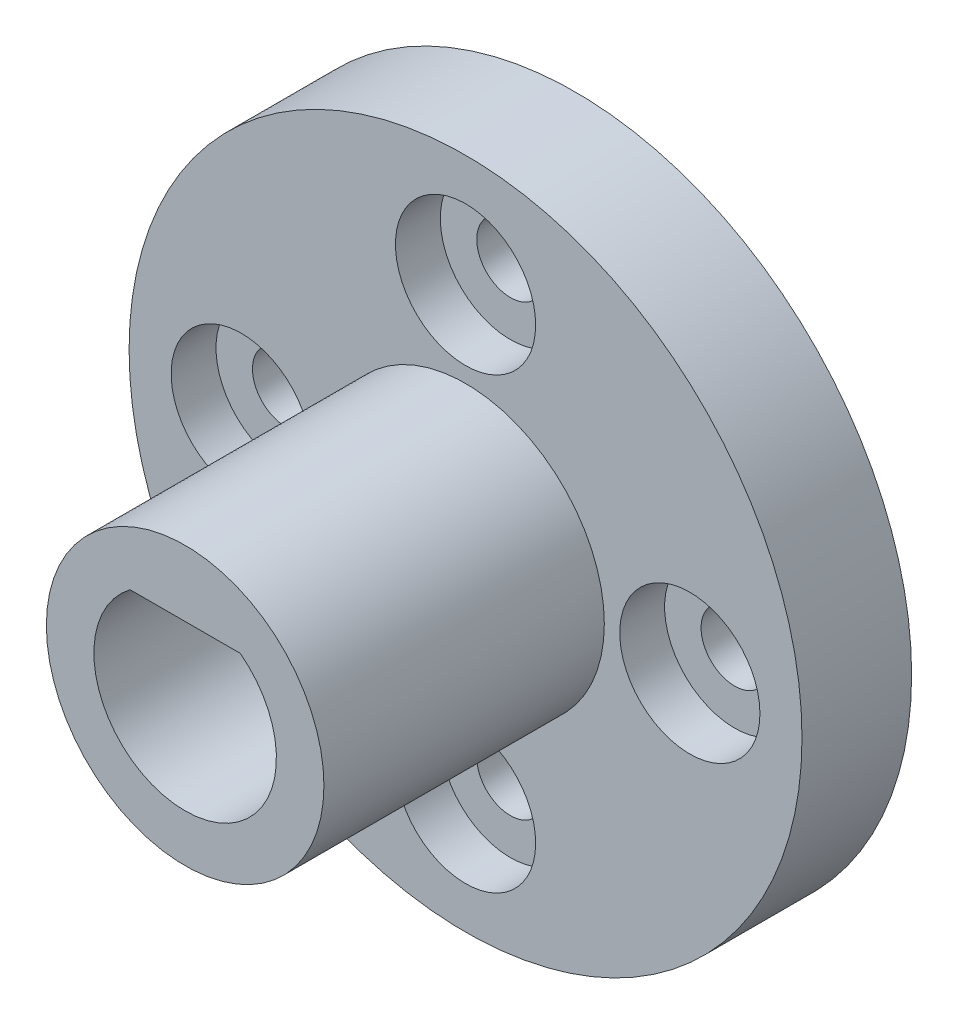
ISO-10303-21;
HEADER;
FILE_DESCRIPTION(('STEP AP214'),'2;1');
FILE_NAME('part.step','',(''),(''),'','','');
FILE_SCHEMA(('AUTOMOTIVE_DESIGN { 1 0 10303 214 1 1 1 1 }'));
ENDSEC;
DATA;
#1=APPLICATION_CONTEXT('core data for automotive mechanical design processes');
#2=APPLICATION_PROTOCOL_DEFINITION('international standard','automotive_design',2000,#1);
#3=PRODUCT_CONTEXT('',#1,'mechanical');
#4=PRODUCT('Part','Part','',(#3));
#5=PRODUCT_RELATED_PRODUCT_CATEGORY('part','',(#4));
#6=PRODUCT_DEFINITION_FORMATION('','',#4);
#7=PRODUCT_DEFINITION_CONTEXT('part definition',#1,'design');
#8=PRODUCT_DEFINITION('design','',#6,#7);
#9=PRODUCT_DEFINITION_SHAPE('','',#8);
#10=(LENGTH_UNIT() NAMED_UNIT(*) SI_UNIT(.MILLI.,.METRE.));
#11=(NAMED_UNIT(*) PLANE_ANGLE_UNIT() SI_UNIT($,.RADIAN.));
#12=(NAMED_UNIT(*) SI_UNIT($,.STERADIAN.) SOLID_ANGLE_UNIT());
#13=UNCERTAINTY_MEASURE_WITH_UNIT(LENGTH_MEASURE(1.E-05),#10,'distance_accuracy_value','');
#14=(GEOMETRIC_REPRESENTATION_CONTEXT(3) GLOBAL_UNCERTAINTY_ASSIGNED_CONTEXT((#13)) GLOBAL_UNIT_ASSIGNED_CONTEXT((#10,
#11,#12)) REPRESENTATION_CONTEXT('',''));
#15=CARTESIAN_POINT('',(0.,0.,0.));
#16=DIRECTION('',(0.,0.,1.));
#17=DIRECTION('',(1.,0.,0.));
#18=AXIS2_PLACEMENT_3D('',#15,#16,#17);
#19=CARTESIAN_POINT('',(0.,0.,3.91));
#20=DIRECTION('',(0.,0.,-1.));
#21=DIRECTION('',(-1.,0.,0.));
#22=AXIS2_PLACEMENT_3D('',#19,#20,#21);
#23=CYLINDRICAL_SURFACE('',#22,12.);
#24=CARTESIAN_POINT('',(0.,0.,3.91));
#25=DIRECTION('',(0.,0.,1.));
#26=DIRECTION('',(1.,0.,0.));
#27=AXIS2_PLACEMENT_3D('',#24,#25,#26);
#28=CIRCLE('',#27,12.);
#29=CARTESIAN_POINT('',(12.,0.,3.91));
#30=VERTEX_POINT('',#29);
#31=EDGE_CURVE('E11',#30,#30,#28,.T.);
#32=ORIENTED_EDGE('',*,*,#31,.F.);
#33=EDGE_LOOP('',(#32));
#34=FACE_BOUND('',#33,.T.);
#35=CARTESIAN_POINT('',(0.,0.,0.));
#36=DIRECTION('',(0.,0.,1.));
#37=DIRECTION('',(1.,0.,0.));
#38=AXIS2_PLACEMENT_3D('',#35,#36,#37);
#39=CIRCLE('',#38,12.);
#40=CARTESIAN_POINT('',(12.,0.,0.));
#41=VERTEX_POINT('',#40);
#42=EDGE_CURVE('E40',#41,#41,#39,.T.);
#43=ORIENTED_EDGE('',*,*,#42,.T.);
#44=EDGE_LOOP('',(#43));
#45=FACE_BOUND('',#44,.T.);
#46=ADVANCED_FACE('F37',(#34,#45),#23,.T.);
#47=CARTESIAN_POINT('',(0.,0.,3.91));
#48=DIRECTION('',(0.,0.,1.));
#49=DIRECTION('',(1.,0.,0.));
#50=AXIS2_PLACEMENT_3D('',#47,#48,#49);
#51=PLANE('',#50);
#52=CARTESIAN_POINT('',(8.,0.,3.91));
#53=DIRECTION('',(0.,0.,1.));
#54=DIRECTION('',(1.,0.,0.));
#55=AXIS2_PLACEMENT_3D('',#52,#53,#54);
#56=CIRCLE('',#55,2.5);
#57=CARTESIAN_POINT('',(10.5,0.,3.91));
#58=VERTEX_POINT('',#57);
#59=EDGE_CURVE('E307',#58,#58,#56,.T.);
#60=ORIENTED_EDGE('',*,*,#59,.F.);
#61=EDGE_LOOP('',(#60));
#62=FACE_BOUND('',#61,.T.);
#63=CARTESIAN_POINT('',(0.,-8.,3.91));
#64=DIRECTION('',(0.,0.,1.));
#65=DIRECTION('',(1.,0.,0.));
#66=AXIS2_PLACEMENT_3D('',#63,#64,#65);
#67=CIRCLE('',#66,2.5);
#68=CARTESIAN_POINT('',(2.5,-8.,3.91));
#69=VERTEX_POINT('',#68);
#70=EDGE_CURVE('E317',#69,#69,#67,.T.);
#71=ORIENTED_EDGE('',*,*,#70,.F.);
#72=EDGE_LOOP('',(#71));
#73=FACE_BOUND('',#72,.T.);
#74=CARTESIAN_POINT('',(-8.,0.,3.91));
#75=DIRECTION('',(0.,0.,1.));
#76=DIRECTION('',(1.,0.,0.));
#77=AXIS2_PLACEMENT_3D('',#74,#75,#76);
#78=CIRCLE('',#77,2.5);
#79=CARTESIAN_POINT('',(-5.50000000000001,0.,3.91));
#80=VERTEX_POINT('',#79);
#81=EDGE_CURVE('E329',#80,#80,#78,.T.);
#82=ORIENTED_EDGE('',*,*,#81,.F.);
#83=EDGE_LOOP('',(#82));
#84=FACE_BOUND('',#83,.T.);
#85=CARTESIAN_POINT('',(0.,8.,3.91));
#86=DIRECTION('',(0.,0.,1.));
#87=DIRECTION('',(1.,0.,0.));
#88=AXIS2_PLACEMENT_3D('',#85,#86,#87);
#89=CIRCLE('',#88,2.5);
#90=CARTESIAN_POINT('',(2.5,8.,3.91));
#91=VERTEX_POINT('',#90);
#92=EDGE_CURVE('E341',#91,#91,#89,.T.);
#93=ORIENTED_EDGE('',*,*,#92,.F.);
#94=EDGE_LOOP('',(#93));
#95=FACE_BOUND('',#94,.T.);
#96=CARTESIAN_POINT('',(0.,0.,3.91));
#97=DIRECTION('',(0.,0.,1.));
#98=DIRECTION('',(1.,0.,0.));
#99=AXIS2_PLACEMENT_3D('',#96,#97,#98);
#100=CIRCLE('',#99,4.95);
#101=CARTESIAN_POINT('',(4.95,0.,3.91));
#102=VERTEX_POINT('',#101);
#103=EDGE_CURVE('E77',#102,#102,#100,.T.);
#104=ORIENTED_EDGE('',*,*,#103,.F.);
#105=EDGE_LOOP('',(#104));
#106=FACE_BOUND('',#105,.T.);
#107=ORIENTED_EDGE('',*,*,#31,.T.);
#108=EDGE_LOOP('',(#107));
#109=FACE_BOUND('',#108,.T.);
#110=ADVANCED_FACE('F96',(#62,#73,#84,#95,#106,#109),#51,.T.);
#111=CARTESIAN_POINT('',(0.,0.,0.));
#112=DIRECTION('',(0.,0.,1.));
#113=DIRECTION('',(1.,0.,0.));
#114=AXIS2_PLACEMENT_3D('',#111,#112,#113);
#115=PLANE('',#114);
#116=CARTESIAN_POINT('',(8.,0.,0.));
#117=DIRECTION('',(0.,0.,1.));
#118=DIRECTION('',(1.,0.,0.));
#119=AXIS2_PLACEMENT_3D('',#116,#117,#118);
#120=CIRCLE('',#119,1.2);
#121=CARTESIAN_POINT('',(9.2,0.,0.));
#122=VERTEX_POINT('',#121);
#123=EDGE_CURVE('E314',#122,#122,#120,.T.);
#124=ORIENTED_EDGE('',*,*,#123,.T.);
#125=EDGE_LOOP('',(#124));
#126=FACE_BOUND('',#125,.T.);
#127=CARTESIAN_POINT('',(0.,-8.,0.));
#128=DIRECTION('',(0.,0.,1.));
#129=DIRECTION('',(1.,0.,0.));
#130=AXIS2_PLACEMENT_3D('',#127,#128,#129);
#131=CIRCLE('',#130,1.2);
#132=CARTESIAN_POINT('',(1.2,-8.,0.));
#133=VERTEX_POINT('',#132);
#134=EDGE_CURVE('E326',#133,#133,#131,.T.);
#135=ORIENTED_EDGE('',*,*,#134,.T.);
#136=EDGE_LOOP('',(#135));
#137=FACE_BOUND('',#136,.T.);
#138=CARTESIAN_POINT('',(-8.,0.,0.));
#139=DIRECTION('',(0.,0.,1.));
#140=DIRECTION('',(1.,0.,0.));
#141=AXIS2_PLACEMENT_3D('',#138,#139,#140);
#142=CIRCLE('',#141,1.2);
#143=CARTESIAN_POINT('',(-6.8,0.,0.));
#144=VERTEX_POINT('',#143);
#145=EDGE_CURVE('E338',#144,#144,#142,.T.);
#146=ORIENTED_EDGE('',*,*,#145,.T.);
#147=EDGE_LOOP('',(#146));
#148=FACE_BOUND('',#147,.T.);
#149=CARTESIAN_POINT('',(0.,8.,0.));
#150=DIRECTION('',(0.,0.,1.));
#151=DIRECTION('',(1.,0.,0.));
#152=AXIS2_PLACEMENT_3D('',#149,#150,#151);
#153=CIRCLE('',#152,1.2);
#154=CARTESIAN_POINT('',(1.2,8.,0.));
#155=VERTEX_POINT('',#154);
#156=EDGE_CURVE('E67',#155,#155,#153,.T.);
#157=ORIENTED_EDGE('',*,*,#156,.T.);
#158=EDGE_LOOP('',(#157));
#159=FACE_BOUND('',#158,.T.);
#160=CARTESIAN_POINT('',(0.,0.,0.));
#161=DIRECTION('',(0.,0.,-1.));
#162=DIRECTION('',(-1.,0.,0.));
#163=AXIS2_PLACEMENT_3D('',#160,#161,#162);
#164=CIRCLE('',#163,4.);
#165=CARTESIAN_POINT('',(-4.,0.,0.));
#166=VERTEX_POINT('',#165);
#167=EDGE_CURVE('E84',#166,#166,#164,.T.);
#168=ORIENTED_EDGE('',*,*,#167,.F.);
#169=EDGE_LOOP('',(#168));
#170=FACE_BOUND('',#169,.T.);
#171=ORIENTED_EDGE('',*,*,#42,.F.);
#172=EDGE_LOOP('',(#171));
#173=FACE_BOUND('',#172,.T.);
#174=ADVANCED_FACE('F93',(#126,#137,#148,#159,#170,#173),#115,.F.);
#175=CARTESIAN_POINT('',(0.,0.,1.91));
#176=DIRECTION('',(0.,0.,-1.));
#177=DIRECTION('',(-1.,0.,0.));
#178=AXIS2_PLACEMENT_3D('',#175,#176,#177);
#179=CYLINDRICAL_SURFACE('',#178,4.);
#180=CARTESIAN_POINT('',(0.,0.,1.91));
#181=DIRECTION('',(0.,0.,-1.));
#182=DIRECTION('',(-1.,0.,0.));
#183=AXIS2_PLACEMENT_3D('',#180,#181,#182);
#184=CIRCLE('',#183,4.);
#185=CARTESIAN_POINT('',(-4.,0.,1.91));
#186=VERTEX_POINT('',#185);
#187=EDGE_CURVE('E85',#186,#186,#184,.T.);
#188=CARTESIAN_POINT('',(-4.,0.,1.91));
#189=CARTESIAN_POINT('',(-4.,0.,1.89010416666667));
#190=CARTESIAN_POINT('',(-4.,0.,1.87020833333333));
#191=CARTESIAN_POINT('',(-4.,0.,1.83041666666667));
#192=CARTESIAN_POINT('',(-4.,0.,1.81052083333333));
#193=CARTESIAN_POINT('',(-4.,0.,1.77072916666667));
#194=CARTESIAN_POINT('',(-4.,0.,1.75083333333333));
#195=CARTESIAN_POINT('',(-4.,0.,1.71104166666667));
#196=CARTESIAN_POINT('',(-4.,0.,1.69114583333333));
#197=CARTESIAN_POINT('',(-4.,0.,1.65135416666667));
#198=CARTESIAN_POINT('',(-4.,0.,1.63145833333333));
#199=CARTESIAN_POINT('',(-4.,0.,1.59166666666667));
#200=CARTESIAN_POINT('',(-4.,0.,1.57177083333333));
#201=CARTESIAN_POINT('',(-4.,0.,1.53197916666667));
#202=CARTESIAN_POINT('',(-4.,0.,1.51208333333333));
#203=CARTESIAN_POINT('',(-4.,0.,1.47229166666667));
#204=CARTESIAN_POINT('',(-4.,0.,1.45239583333333));
#205=CARTESIAN_POINT('',(-4.,0.,1.41260416666667));
#206=CARTESIAN_POINT('',(-4.,0.,1.39270833333333));
#207=CARTESIAN_POINT('',(-4.,0.,1.35291666666667));
#208=CARTESIAN_POINT('',(-4.,0.,1.33302083333333));
#209=CARTESIAN_POINT('',(-4.,0.,1.29322916666667));
#210=CARTESIAN_POINT('',(-4.,0.,1.27333333333333));
#211=CARTESIAN_POINT('',(-4.,0.,1.23354166666667));
#212=CARTESIAN_POINT('',(-4.,0.,1.21364583333333));
#213=CARTESIAN_POINT('',(-4.,0.,1.17385416666667));
#214=CARTESIAN_POINT('',(-4.,0.,1.15395833333333));
#215=CARTESIAN_POINT('',(-4.,0.,1.11416666666667));
#216=CARTESIAN_POINT('',(-4.,0.,1.09427083333333));
#217=CARTESIAN_POINT('',(-4.,0.,1.05447916666667));
#218=CARTESIAN_POINT('',(-4.,0.,1.03458333333333));
#219=CARTESIAN_POINT('',(-4.,0.,0.994791666666667));
#220=CARTESIAN_POINT('',(-4.,0.,0.974895833333334));
#221=CARTESIAN_POINT('',(-4.,0.,0.935104166666667));
#222=CARTESIAN_POINT('',(-4.,0.,0.915208333333333));
#223=CARTESIAN_POINT('',(-4.,0.,0.875416666666667));
#224=CARTESIAN_POINT('',(-4.,0.,0.855520833333333));
#225=CARTESIAN_POINT('',(-4.,0.,0.815729166666667));
#226=CARTESIAN_POINT('',(-4.,0.,0.795833333333333));
#227=CARTESIAN_POINT('',(-4.,0.,0.756041666666667));
#228=CARTESIAN_POINT('',(-4.,0.,0.736145833333333));
#229=CARTESIAN_POINT('',(-4.,0.,0.696354166666667));
#230=CARTESIAN_POINT('',(-4.,0.,0.676458333333333));
#231=CARTESIAN_POINT('',(-4.,0.,0.636666666666667));
#232=CARTESIAN_POINT('',(-4.,0.,0.616770833333333));
#233=CARTESIAN_POINT('',(-4.,0.,0.576979166666667));
#234=CARTESIAN_POINT('',(-4.,0.,0.557083333333333));
#235=CARTESIAN_POINT('',(-4.,0.,0.517291666666667));
#236=CARTESIAN_POINT('',(-4.,0.,0.497395833333333));
#237=CARTESIAN_POINT('',(-4.,0.,0.457604166666667));
#238=CARTESIAN_POINT('',(-4.,0.,0.437708333333333));
#239=CARTESIAN_POINT('',(-4.,0.,0.397916666666667));
#240=CARTESIAN_POINT('',(-4.,0.,0.378020833333333));
#241=CARTESIAN_POINT('',(-4.,0.,0.338229166666667));
#242=CARTESIAN_POINT('',(-4.,0.,0.318333333333333));
#243=CARTESIAN_POINT('',(-4.,0.,0.278541666666667));
#244=CARTESIAN_POINT('',(-4.,0.,0.258645833333333));
#245=CARTESIAN_POINT('',(-4.,0.,0.218854166666667));
#246=CARTESIAN_POINT('',(-4.,0.,0.198958333333333));
#247=CARTESIAN_POINT('',(-4.,0.,0.159166666666667));
#248=CARTESIAN_POINT('',(-4.,0.,0.139270833333333));
#249=CARTESIAN_POINT('',(-4.,0.,0.0994791666666668));
#250=CARTESIAN_POINT('',(-4.,0.,0.0795833333333334));
#251=CARTESIAN_POINT('',(-4.,0.,0.0397916666666667));
#252=CARTESIAN_POINT('',(-4.,0.,0.0198958333333334));
#253=CARTESIAN_POINT('',(-4.,0.,0.));
#254=B_SPLINE_CURVE_WITH_KNOTS('',3,(#188,#189,#190,#191,#192,#193,#194,#195,#196,#197,#198,
#199,#200,#201,#202,#203,#204,#205,#206,#207,#208,#209,#210,#211,#212,#213,#214,#215,#216,#217,
#218,#219,#220,#221,#222,#223,#224,#225,#226,#227,#228,#229,#230,#231,#232,#233,#234,#235,#236,
#237,#238,#239,#240,#241,#242,#243,#244,#245,#246,#247,#248,#249,#250,#251,#252,#253),
.UNSPECIFIED.,.F.,.F.,(4,2,2,2,2,2,2,2,2,2,2,2,2,2,2,2,2,2,2,2,2,2,2,2,2,2,2,2,2,2,2,2,4),(0.,
0.0596874999999998,0.119375,0.1790625,0.23875,0.2984375,0.358125,0.4178125,0.4775,0.5371875,
0.596875,0.6565625,0.71625,0.7759375,0.835625,0.8953125,0.955,1.0146875,1.074375,1.1340625,
1.19375,1.2534375,1.313125,1.3728125,1.4325,1.4921875,1.551875,1.6115625,1.67125,1.7309375,
1.790625,1.8503125,1.91),.UNSPECIFIED.);
#255=EDGE_CURVE('BSEAM91',#186,#166,#254,.T.);
#256=ORIENTED_EDGE('',*,*,#187,.F.);
#257=ORIENTED_EDGE('',*,*,#167,.T.);
#258=ORIENTED_EDGE('',*,*,#255,.T.);
#259=ORIENTED_EDGE('',*,*,#255,.F.);
#260=EDGE_LOOP('',(#256,#258,#257,#259));
#261=FACE_BOUND('',#260,.T.);
#262=ADVANCED_FACE('F91',(#261),#179,.F.);
#263=CARTESIAN_POINT('',(0.,0.,1.91));
#264=DIRECTION('',(0.,0.,-1.));
#265=DIRECTION('',(-1.,0.,0.));
#266=AXIS2_PLACEMENT_3D('',#263,#264,#265);
#267=PLANE('',#266);
#268=ORIENTED_EDGE('',*,*,#187,.T.);
#269=EDGE_LOOP('',(#268));
#270=FACE_BOUND('',#269,.T.);
#271=ADVANCED_FACE('F140',(#270),#267,.T.);
#272=CARTESIAN_POINT('',(0.,2.595,13.91));
#273=DIRECTION('',(0.,-1.,0.));
#274=DIRECTION('',(0.,0.,-1.));
#275=AXIS2_PLACEMENT_3D('',#272,#273,#274);
#276=PLANE('',#275);
#277=DIRECTION('',(-1.,0.,0.));
#278=VECTOR('',#277,1.);
#279=CARTESIAN_POINT('',(0.,2.595,3.91));
#280=LINE('',#279,#278);
#281=CARTESIAN_POINT('',(1.96494274725754,2.595,3.91));
#282=VERTEX_POINT('',#281);
#283=CARTESIAN_POINT('',(-1.96494274725754,2.595,3.91));
#284=VERTEX_POINT('',#283);
#285=EDGE_CURVE('E64',#282,#284,#280,.T.);
#286=ORIENTED_EDGE('',*,*,#285,.F.);
#287=DIRECTION('',(0.,0.,-1.));
#288=VECTOR('',#287,1.);
#289=CARTESIAN_POINT('',(1.96494274725754,2.595,13.91));
#290=LINE('',#289,#288);
#291=CARTESIAN_POINT('',(1.96494274725754,2.595,13.91));
#292=VERTEX_POINT('',#291);
#293=EDGE_CURVE('E73',#292,#282,#290,.T.);
#294=ORIENTED_EDGE('',*,*,#293,.F.);
#295=DIRECTION('',(-1.,0.,0.));
#296=VECTOR('',#295,1.);
#297=CARTESIAN_POINT('',(0.,2.595,13.91));
#298=LINE('',#297,#296);
#299=CARTESIAN_POINT('',(-1.96494274725754,2.595,13.91));
#300=VERTEX_POINT('',#299);
#301=EDGE_CURVE('E71',#292,#300,#298,.T.);
#302=ORIENTED_EDGE('',*,*,#301,.T.);
#303=DIRECTION('',(0.,0.,-1.));
#304=VECTOR('',#303,1.);
#305=CARTESIAN_POINT('',(-1.96494274725754,2.595,13.91));
#306=LINE('',#305,#304);
#307=EDGE_CURVE('E58',#300,#284,#306,.T.);
#308=ORIENTED_EDGE('',*,*,#307,.T.);
#309=EDGE_LOOP('',(#286,#294,#302,#308));
#310=FACE_BOUND('',#309,.T.);
#311=ADVANCED_FACE('F69',(#310),#276,.T.);
#312=CARTESIAN_POINT('',(0.,0.,13.91));
#313=DIRECTION('',(0.,0.,-1.));
#314=DIRECTION('',(-1.,0.,0.));
#315=AXIS2_PLACEMENT_3D('',#312,#313,#314);
#316=CYLINDRICAL_SURFACE('',#315,3.255);
#317=CARTESIAN_POINT('',(0.,0.,3.91));
#318=DIRECTION('',(0.,0.,1.));
#319=DIRECTION('',(1.,0.,0.));
#320=AXIS2_PLACEMENT_3D('',#317,#318,#319);
#321=CIRCLE('',#320,3.255);
#322=EDGE_CURVE('E50',#284,#282,#321,.T.);
#323=ORIENTED_EDGE('',*,*,#322,.F.);
#324=ORIENTED_EDGE('',*,*,#307,.F.);
#325=CARTESIAN_POINT('',(0.,0.,13.91));
#326=DIRECTION('',(0.,0.,1.));
#327=DIRECTION('',(1.,0.,0.));
#328=AXIS2_PLACEMENT_3D('',#325,#326,#327);
#329=CIRCLE('',#328,3.255);
#330=EDGE_CURVE('E353',#300,#292,#329,.T.);
#331=ORIENTED_EDGE('',*,*,#330,.T.);
#332=ORIENTED_EDGE('',*,*,#293,.T.);
#333=EDGE_LOOP('',(#323,#324,#331,#332));
#334=FACE_BOUND('',#333,.T.);
#335=ADVANCED_FACE('F76',(#334),#316,.F.);
#336=CARTESIAN_POINT('',(0.,0.,13.91));
#337=DIRECTION('',(0.,0.,-1.));
#338=DIRECTION('',(-1.,0.,0.));
#339=AXIS2_PLACEMENT_3D('',#336,#337,#338);
#340=CYLINDRICAL_SURFACE('',#339,4.95);
#341=CARTESIAN_POINT('',(0.,0.,13.91));
#342=DIRECTION('',(0.,0.,1.));
#343=DIRECTION('',(1.,0.,0.));
#344=AXIS2_PLACEMENT_3D('',#341,#342,#343);
#345=CIRCLE('',#344,4.95);
#346=CARTESIAN_POINT('',(4.95,0.,13.91));
#347=VERTEX_POINT('',#346);
#348=EDGE_CURVE('E74',#347,#347,#345,.T.);
#349=ORIENTED_EDGE('',*,*,#348,.F.);
#350=EDGE_LOOP('',(#349));
#351=FACE_BOUND('',#350,.T.);
#352=ORIENTED_EDGE('',*,*,#103,.T.);
#353=EDGE_LOOP('',(#352));
#354=FACE_BOUND('',#353,.T.);
#355=ADVANCED_FACE('F125',(#351,#354),#340,.T.);
#356=CARTESIAN_POINT('',(0.,0.,13.91));
#357=DIRECTION('',(0.,0.,1.));
#358=DIRECTION('',(1.,0.,0.));
#359=AXIS2_PLACEMENT_3D('',#356,#357,#358);
#360=PLANE('',#359);
#361=ORIENTED_EDGE('',*,*,#301,.F.);
#362=ORIENTED_EDGE('',*,*,#330,.F.);
#363=EDGE_LOOP('',(#361,#362));
#364=FACE_BOUND('',#363,.T.);
#365=ORIENTED_EDGE('',*,*,#348,.T.);
#366=EDGE_LOOP('',(#365));
#367=FACE_BOUND('',#366,.T.);
#368=ADVANCED_FACE('F117',(#364,#367),#360,.T.);
#369=ORIENTED_EDGE('',*,*,#285,.T.);
#370=ORIENTED_EDGE('',*,*,#322,.T.);
#371=EDGE_LOOP('',(#369,#370));
#372=FACE_BOUND('',#371,.T.);
#373=ADVANCED_FACE('F65',(#372),#51,.T.);
#374=CARTESIAN_POINT('',(0.,8.,3.91));
#375=DIRECTION('',(0.,0.,1.));
#376=DIRECTION('',(1.,0.,0.));
#377=AXIS2_PLACEMENT_3D('',#374,#375,#376);
#378=CYLINDRICAL_SURFACE('',#377,1.2);
#379=ORIENTED_EDGE('',*,*,#156,.F.);
#380=EDGE_LOOP('',(#379));
#381=FACE_BOUND('',#380,.T.);
#382=CARTESIAN_POINT('',(0.,8.,2.31));
#383=DIRECTION('',(0.,0.,1.));
#384=DIRECTION('',(1.,0.,0.));
#385=AXIS2_PLACEMENT_3D('',#382,#383,#384);
#386=CIRCLE('',#385,1.2);
#387=CARTESIAN_POINT('',(1.2,8.,2.31));
#388=VERTEX_POINT('',#387);
#389=EDGE_CURVE('E347',#388,#388,#386,.T.);
#390=ORIENTED_EDGE('',*,*,#389,.T.);
#391=EDGE_LOOP('',(#390));
#392=FACE_BOUND('',#391,.T.);
#393=ADVANCED_FACE('F116',(#381,#392),#378,.F.);
#394=CARTESIAN_POINT('',(1.2,8.,2.31));
#395=DIRECTION('',(0.,0.,-1.));
#396=DIRECTION('',(-1.,0.,0.));
#397=AXIS2_PLACEMENT_3D('',#394,#395,#396);
#398=PLANE('',#397);
#399=ORIENTED_EDGE('',*,*,#389,.F.);
#400=EDGE_LOOP('',(#399));
#401=FACE_BOUND('',#400,.T.);
#402=CARTESIAN_POINT('',(0.,8.,2.31));
#403=DIRECTION('',(0.,0.,1.));
#404=DIRECTION('',(1.,0.,0.));
#405=AXIS2_PLACEMENT_3D('',#402,#403,#404);
#406=CIRCLE('',#405,2.5);
#407=CARTESIAN_POINT('',(2.5,8.,2.31));
#408=VERTEX_POINT('',#407);
#409=EDGE_CURVE('E344',#408,#408,#406,.T.);
#410=ORIENTED_EDGE('',*,*,#409,.T.);
#411=EDGE_LOOP('',(#410));
#412=FACE_BOUND('',#411,.T.);
#413=ADVANCED_FACE('F122',(#401,#412),#398,.F.);
#414=CARTESIAN_POINT('',(0.,8.,3.91));
#415=DIRECTION('',(0.,0.,1.));
#416=DIRECTION('',(1.,0.,0.));
#417=AXIS2_PLACEMENT_3D('',#414,#415,#416);
#418=CYLINDRICAL_SURFACE('',#417,2.5);
#419=ORIENTED_EDGE('',*,*,#409,.F.);
#420=EDGE_LOOP('',(#419));
#421=FACE_BOUND('',#420,.T.);
#422=ORIENTED_EDGE('',*,*,#92,.T.);
#423=EDGE_LOOP('',(#422));
#424=FACE_BOUND('',#423,.T.);
#425=ADVANCED_FACE('F190',(#421,#424),#418,.F.);
#426=CARTESIAN_POINT('',(-8.,0.,3.91));
#427=DIRECTION('',(0.,0.,1.));
#428=DIRECTION('',(1.,0.,0.));
#429=AXIS2_PLACEMENT_3D('',#426,#427,#428);
#430=CYLINDRICAL_SURFACE('',#429,1.2);
#431=ORIENTED_EDGE('',*,*,#145,.F.);
#432=EDGE_LOOP('',(#431));
#433=FACE_BOUND('',#432,.T.);
#434=CARTESIAN_POINT('',(-8.,0.,2.31));
#435=DIRECTION('',(0.,0.,1.));
#436=DIRECTION('',(1.,0.,0.));
#437=AXIS2_PLACEMENT_3D('',#434,#435,#436);
#438=CIRCLE('',#437,1.2);
#439=CARTESIAN_POINT('',(-6.8,0.,2.31));
#440=VERTEX_POINT('',#439);
#441=EDGE_CURVE('E335',#440,#440,#438,.T.);
#442=ORIENTED_EDGE('',*,*,#441,.T.);
#443=EDGE_LOOP('',(#442));
#444=FACE_BOUND('',#443,.T.);
#445=ADVANCED_FACE('F198',(#433,#444),#430,.F.);
#446=CARTESIAN_POINT('',(-6.8,0.,2.31));
#447=DIRECTION('',(0.,0.,-1.));
#448=DIRECTION('',(-1.,0.,0.));
#449=AXIS2_PLACEMENT_3D('',#446,#447,#448);
#450=PLANE('',#449);
#451=ORIENTED_EDGE('',*,*,#441,.F.);
#452=EDGE_LOOP('',(#451));
#453=FACE_BOUND('',#452,.T.);
#454=CARTESIAN_POINT('',(-8.,0.,2.31));
#455=DIRECTION('',(0.,0.,1.));
#456=DIRECTION('',(1.,0.,0.));
#457=AXIS2_PLACEMENT_3D('',#454,#455,#456);
#458=CIRCLE('',#457,2.5);
#459=CARTESIAN_POINT('',(-5.5,0.,2.31));
#460=VERTEX_POINT('',#459);
#461=EDGE_CURVE('E332',#460,#460,#458,.T.);
#462=ORIENTED_EDGE('',*,*,#461,.T.);
#463=EDGE_LOOP('',(#462));
#464=FACE_BOUND('',#463,.T.);
#465=ADVANCED_FACE('F218',(#453,#464),#450,.F.);
#466=CARTESIAN_POINT('',(-8.,0.,3.91));
#467=DIRECTION('',(0.,0.,1.));
#468=DIRECTION('',(1.,0.,0.));
#469=AXIS2_PLACEMENT_3D('',#466,#467,#468);
#470=CYLINDRICAL_SURFACE('',#469,2.5);
#471=ORIENTED_EDGE('',*,*,#461,.F.);
#472=EDGE_LOOP('',(#471));
#473=FACE_BOUND('',#472,.T.);
#474=ORIENTED_EDGE('',*,*,#81,.T.);
#475=EDGE_LOOP('',(#474));
#476=FACE_BOUND('',#475,.T.);
#477=ADVANCED_FACE('F228',(#473,#476),#470,.F.);
#478=CARTESIAN_POINT('',(0.,-8.,3.91));
#479=DIRECTION('',(0.,0.,1.));
#480=DIRECTION('',(1.,0.,0.));
#481=AXIS2_PLACEMENT_3D('',#478,#479,#480);
#482=CYLINDRICAL_SURFACE('',#481,1.2);
#483=ORIENTED_EDGE('',*,*,#134,.F.);
#484=EDGE_LOOP('',(#483));
#485=FACE_BOUND('',#484,.T.);
#486=CARTESIAN_POINT('',(0.,-8.,2.31));
#487=DIRECTION('',(0.,0.,1.));
#488=DIRECTION('',(1.,0.,0.));
#489=AXIS2_PLACEMENT_3D('',#486,#487,#488);
#490=CIRCLE('',#489,1.2);
#491=CARTESIAN_POINT('',(1.2,-8.,2.31));
#492=VERTEX_POINT('',#491);
#493=EDGE_CURVE('E323',#492,#492,#490,.T.);
#494=ORIENTED_EDGE('',*,*,#493,.T.);
#495=EDGE_LOOP('',(#494));
#496=FACE_BOUND('',#495,.T.);
#497=ADVANCED_FACE('F238',(#485,#496),#482,.F.);
#498=CARTESIAN_POINT('',(1.2,-8.,2.31));
#499=DIRECTION('',(0.,0.,-1.));
#500=DIRECTION('',(-1.,0.,0.));
#501=AXIS2_PLACEMENT_3D('',#498,#499,#500);
#502=PLANE('',#501);
#503=ORIENTED_EDGE('',*,*,#493,.F.);
#504=EDGE_LOOP('',(#503));
#505=FACE_BOUND('',#504,.T.);
#506=CARTESIAN_POINT('',(0.,-8.,2.31));
#507=DIRECTION('',(0.,0.,1.));
#508=DIRECTION('',(1.,0.,0.));
#509=AXIS2_PLACEMENT_3D('',#506,#507,#508);
#510=CIRCLE('',#509,2.5);
#511=CARTESIAN_POINT('',(2.5,-8.,2.31));
#512=VERTEX_POINT('',#511);
#513=EDGE_CURVE('E320',#512,#512,#510,.T.);
#514=ORIENTED_EDGE('',*,*,#513,.T.);
#515=EDGE_LOOP('',(#514));
#516=FACE_BOUND('',#515,.T.);
#517=ADVANCED_FACE('F248',(#505,#516),#502,.F.);
#518=CARTESIAN_POINT('',(0.,-8.,3.91));
#519=DIRECTION('',(0.,0.,1.));
#520=DIRECTION('',(1.,0.,0.));
#521=AXIS2_PLACEMENT_3D('',#518,#519,#520);
#522=CYLINDRICAL_SURFACE('',#521,2.5);
#523=ORIENTED_EDGE('',*,*,#513,.F.);
#524=EDGE_LOOP('',(#523));
#525=FACE_BOUND('',#524,.T.);
#526=ORIENTED_EDGE('',*,*,#70,.T.);
#527=EDGE_LOOP('',(#526));
#528=FACE_BOUND('',#527,.T.);
#529=ADVANCED_FACE('F258',(#525,#528),#522,.F.);
#530=CARTESIAN_POINT('',(8.,0.,3.91));
#531=DIRECTION('',(0.,0.,1.));
#532=DIRECTION('',(1.,0.,0.));
#533=AXIS2_PLACEMENT_3D('',#530,#531,#532);
#534=CYLINDRICAL_SURFACE('',#533,1.2);
#535=ORIENTED_EDGE('',*,*,#123,.F.);
#536=EDGE_LOOP('',(#535));
#537=FACE_BOUND('',#536,.T.);
#538=CARTESIAN_POINT('',(8.,0.,2.31));
#539=DIRECTION('',(0.,0.,1.));
#540=DIRECTION('',(1.,0.,0.));
#541=AXIS2_PLACEMENT_3D('',#538,#539,#540);
#542=CIRCLE('',#541,1.2);
#543=CARTESIAN_POINT('',(9.2,0.,2.31));
#544=VERTEX_POINT('',#543);
#545=EDGE_CURVE('E309',#544,#544,#542,.T.);
#546=ORIENTED_EDGE('',*,*,#545,.T.);
#547=EDGE_LOOP('',(#546));
#548=FACE_BOUND('',#547,.T.);
#549=ADVANCED_FACE('F268',(#537,#548),#534,.F.);
#550=CARTESIAN_POINT('',(9.2,0.,2.31));
#551=DIRECTION('',(0.,0.,-1.));
#552=DIRECTION('',(-1.,0.,0.));
#553=AXIS2_PLACEMENT_3D('',#550,#551,#552);
#554=PLANE('',#553);
#555=ORIENTED_EDGE('',*,*,#545,.F.);
#556=EDGE_LOOP('',(#555));
#557=FACE_BOUND('',#556,.T.);
#558=CARTESIAN_POINT('',(8.,0.,2.31));
#559=DIRECTION('',(0.,0.,1.));
#560=DIRECTION('',(1.,0.,0.));
#561=AXIS2_PLACEMENT_3D('',#558,#559,#560);
#562=CIRCLE('',#561,2.5);
#563=CARTESIAN_POINT('',(10.5,0.,2.31));
#564=VERTEX_POINT('',#563);
#565=EDGE_CURVE('E305',#564,#564,#562,.T.);
#566=ORIENTED_EDGE('',*,*,#565,.T.);
#567=EDGE_LOOP('',(#566));
#568=FACE_BOUND('',#567,.T.);
#569=ADVANCED_FACE('F278',(#557,#568),#554,.F.);
#570=CARTESIAN_POINT('',(8.,0.,3.91));
#571=DIRECTION('',(0.,0.,1.));
#572=DIRECTION('',(1.,0.,0.));
#573=AXIS2_PLACEMENT_3D('',#570,#571,#572);
#574=CYLINDRICAL_SURFACE('',#573,2.5);
#575=ORIENTED_EDGE('',*,*,#565,.F.);
#576=EDGE_LOOP('',(#575));
#577=FACE_BOUND('',#576,.T.);
#578=ORIENTED_EDGE('',*,*,#59,.T.);
#579=EDGE_LOOP('',(#578));
#580=FACE_BOUND('',#579,.T.);
#581=ADVANCED_FACE('F288',(#577,#580),#574,.F.);
#582=CLOSED_SHELL('',(#46,#110,#174,#262,#271,#311,#335,#355,#368,#373,#393,#413,#425,#445,#465,
#477,#497,#517,#529,#549,#569,#581));
#583=MANIFOLD_SOLID_BREP('B2',#582);
#584=ADVANCED_BREP_SHAPE_REPRESENTATION('',(#18,#583),#14);
#585=SHAPE_DEFINITION_REPRESENTATION(#9,#584);
ENDSEC;
END-ISO-10303-21;
